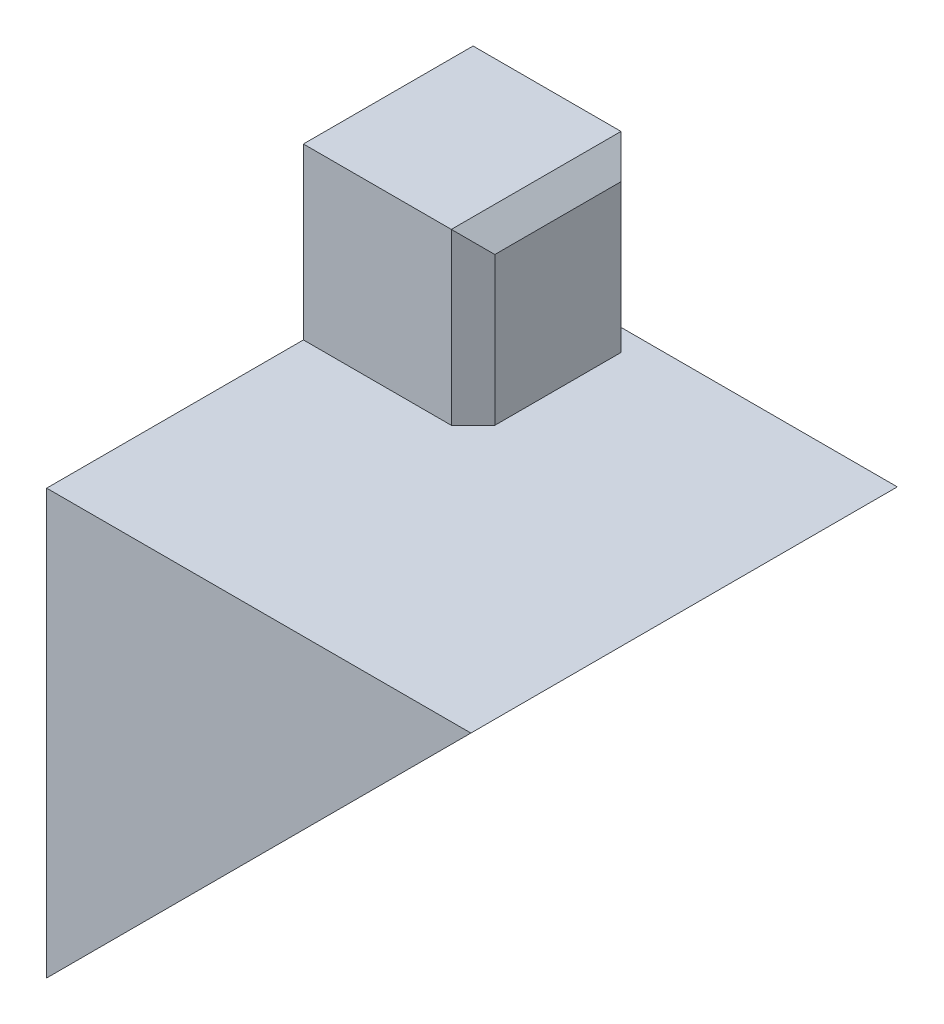
ISO-10303-21;
HEADER;
FILE_DESCRIPTION(('STEP AP214'),'2;1');
FILE_NAME('part.step','',(''),(''),'','','');
FILE_SCHEMA(('AUTOMOTIVE_DESIGN { 1 0 10303 214 1 1 1 1 }'));
ENDSEC;
DATA;
#1=APPLICATION_CONTEXT('core data for automotive mechanical design processes');
#2=APPLICATION_PROTOCOL_DEFINITION('international standard','automotive_design',2000,#1);
#3=PRODUCT_CONTEXT('',#1,'mechanical');
#4=PRODUCT('Part','Part','',(#3));
#5=PRODUCT_RELATED_PRODUCT_CATEGORY('part','',(#4));
#6=PRODUCT_DEFINITION_FORMATION('','',#4);
#7=PRODUCT_DEFINITION_CONTEXT('part definition',#1,'design');
#8=PRODUCT_DEFINITION('design','',#6,#7);
#9=PRODUCT_DEFINITION_SHAPE('','',#8);
#10=(LENGTH_UNIT() NAMED_UNIT(*) SI_UNIT(.MILLI.,.METRE.));
#11=(NAMED_UNIT(*) PLANE_ANGLE_UNIT() SI_UNIT($,.RADIAN.));
#12=(NAMED_UNIT(*) SI_UNIT($,.STERADIAN.) SOLID_ANGLE_UNIT());
#13=UNCERTAINTY_MEASURE_WITH_UNIT(LENGTH_MEASURE(1.E-05),#10,'distance_accuracy_value','');
#14=(GEOMETRIC_REPRESENTATION_CONTEXT(3) GLOBAL_UNCERTAINTY_ASSIGNED_CONTEXT((#13)) GLOBAL_UNIT_ASSIGNED_CONTEXT((#10,
#11,#12)) REPRESENTATION_CONTEXT('',''));
#15=CARTESIAN_POINT('',(0.,0.,0.));
#16=DIRECTION('',(0.,0.,1.));
#17=DIRECTION('',(1.,0.,0.));
#18=AXIS2_PLACEMENT_3D('',#15,#16,#17);
#19=CARTESIAN_POINT('',(0.,0.,-19.6));
#20=DIRECTION('',(0.,1.,0.));
#21=DIRECTION('',(0.,0.,1.));
#22=AXIS2_PLACEMENT_3D('',#19,#20,#21);
#23=PLANE('',#22);
#24=DIRECTION('',(1.,0.,0.));
#25=VECTOR('',#24,1.);
#26=CARTESIAN_POINT('',(0.,0.,-11.8));
#27=LINE('',#26,#25);
#28=CARTESIAN_POINT('',(0.,0.,-11.8));
#29=VERTEX_POINT('',#28);
#30=CARTESIAN_POINT('',(6.8,0.,-11.8));
#31=VERTEX_POINT('',#30);
#32=EDGE_CURVE('E140',#29,#31,#27,.T.);
#33=ORIENTED_EDGE('',*,*,#32,.F.);
#34=DIRECTION('',(0.,0.,1.));
#35=VECTOR('',#34,1.);
#36=CARTESIAN_POINT('',(0.,0.,-19.6));
#37=LINE('',#36,#35);
#38=CARTESIAN_POINT('',(0.,0.,0.));
#39=VERTEX_POINT('',#38);
#40=EDGE_CURVE('E153',#29,#39,#37,.T.);
#41=ORIENTED_EDGE('',*,*,#40,.T.);
#42=DIRECTION('',(-1.,0.,0.));
#43=VECTOR('',#42,1.);
#44=CARTESIAN_POINT('',(0.,0.,0.));
#45=LINE('',#44,#43);
#46=CARTESIAN_POINT('',(19.5,0.,0.));
#47=VERTEX_POINT('',#46);
#48=EDGE_CURVE('E136',#47,#39,#45,.T.);
#49=ORIENTED_EDGE('',*,*,#48,.F.);
#50=DIRECTION('',(0.,0.,1.));
#51=VECTOR('',#50,1.);
#52=CARTESIAN_POINT('',(19.5,0.,-19.6));
#53=LINE('',#52,#51);
#54=CARTESIAN_POINT('',(19.5,0.,-19.6));
#55=VERTEX_POINT('',#54);
#56=EDGE_CURVE('E164',#55,#47,#53,.T.);
#57=ORIENTED_EDGE('',*,*,#56,.F.);
#58=DIRECTION('',(-1.,0.,0.));
#59=VECTOR('',#58,1.);
#60=CARTESIAN_POINT('',(0.,0.,-19.6));
#61=LINE('',#60,#59);
#62=CARTESIAN_POINT('',(6.8,0.,-19.6));
#63=VERTEX_POINT('',#62);
#64=EDGE_CURVE('E59',#55,#63,#61,.T.);
#65=ORIENTED_EDGE('',*,*,#64,.T.);
#66=DIRECTION('',(0.707106781186545,0.,0.70710678118655));
#67=VECTOR('',#66,1.);
#68=CARTESIAN_POINT('',(6.8,0.,-19.6));
#69=LINE('',#68,#67);
#70=CARTESIAN_POINT('',(7.8,0.,-18.6));
#71=VERTEX_POINT('',#70);
#72=EDGE_CURVE('E11',#63,#71,#69,.T.);
#73=ORIENTED_EDGE('',*,*,#72,.T.);
#74=DIRECTION('',(0.,0.,-1.));
#75=VECTOR('',#74,1.);
#76=CARTESIAN_POINT('',(7.8,0.,0.));
#77=LINE('',#76,#75);
#78=CARTESIAN_POINT('',(7.8,0.,-12.8));
#79=VERTEX_POINT('',#78);
#80=EDGE_CURVE('E144',#79,#71,#77,.T.);
#81=ORIENTED_EDGE('',*,*,#80,.F.);
#82=DIRECTION('',(0.707106781186545,0.,-0.70710678118655));
#83=VECTOR('',#82,1.);
#84=CARTESIAN_POINT('',(7.8,0.,-12.8));
#85=LINE('',#84,#83);
#86=EDGE_CURVE('E52',#79,#31,#85,.F.);
#87=ORIENTED_EDGE('',*,*,#86,.T.);
#88=EDGE_LOOP('',(#33,#41,#49,#57,#65,#73,#81,#87));
#89=FACE_BOUND('',#88,.T.);
#90=ADVANCED_FACE('F41',(#89),#23,.T.);
#91=CARTESIAN_POINT('',(19.5,0.,-19.6));
#92=DIRECTION('',(0.707106781186548,-0.707106781186547,0.));
#93=DIRECTION('',(0.707106781186547,0.707106781186548,0.));
#94=AXIS2_PLACEMENT_3D('',#91,#92,#93);
#95=PLANE('',#94);
#96=DIRECTION('',(0.707106781186547,0.707106781186548,0.));
#97=VECTOR('',#96,1.);
#98=CARTESIAN_POINT('',(19.5,0.,0.));
#99=LINE('',#98,#97);
#100=CARTESIAN_POINT('',(0.,-19.5,0.));
#101=VERTEX_POINT('',#100);
#102=EDGE_CURVE('E149',#101,#47,#99,.T.);
#103=ORIENTED_EDGE('',*,*,#102,.F.);
#104=DIRECTION('',(0.,0.,1.));
#105=VECTOR('',#104,1.);
#106=CARTESIAN_POINT('',(0.,-19.5,-19.6));
#107=LINE('',#106,#105);
#108=CARTESIAN_POINT('',(0.,-19.5,-19.6));
#109=VERTEX_POINT('',#108);
#110=EDGE_CURVE('E168',#109,#101,#107,.T.);
#111=ORIENTED_EDGE('',*,*,#110,.F.);
#112=DIRECTION('',(0.707106781186547,0.707106781186548,0.));
#113=VECTOR('',#112,1.);
#114=CARTESIAN_POINT('',(19.5,0.,-19.6));
#115=LINE('',#114,#113);
#116=EDGE_CURVE('E123',#109,#55,#115,.T.);
#117=ORIENTED_EDGE('',*,*,#116,.T.);
#118=ORIENTED_EDGE('',*,*,#56,.T.);
#119=EDGE_LOOP('',(#103,#111,#117,#118));
#120=FACE_BOUND('',#119,.T.);
#121=ADVANCED_FACE('F209',(#120),#95,.T.);
#122=CARTESIAN_POINT('',(0.,0.,-19.6));
#123=DIRECTION('',(-1.,0.,0.));
#124=DIRECTION('',(0.,-1.,0.));
#125=AXIS2_PLACEMENT_3D('',#122,#123,#124);
#126=PLANE('',#125);
#127=DIRECTION('',(0.,-1.,0.));
#128=VECTOR('',#127,1.);
#129=CARTESIAN_POINT('',(0.,0.,0.));
#130=LINE('',#129,#128);
#131=EDGE_CURVE('E157',#39,#101,#130,.T.);
#132=ORIENTED_EDGE('',*,*,#131,.F.);
#133=ORIENTED_EDGE('',*,*,#40,.F.);
#134=DIRECTION('',(0.,-1.,0.));
#135=VECTOR('',#134,1.);
#136=CARTESIAN_POINT('',(0.,7.8,-11.8));
#137=LINE('',#136,#135);
#138=CARTESIAN_POINT('',(0.,7.8,-11.8));
#139=VERTEX_POINT('',#138);
#140=EDGE_CURVE('E131',#139,#29,#137,.T.);
#141=ORIENTED_EDGE('',*,*,#140,.F.);
#142=DIRECTION('',(0.,0.,1.));
#143=VECTOR('',#142,1.);
#144=CARTESIAN_POINT('',(0.,7.8,0.));
#145=LINE('',#144,#143);
#146=CARTESIAN_POINT('',(0.,7.8,-19.6));
#147=VERTEX_POINT('',#146);
#148=EDGE_CURVE('E111',#147,#139,#145,.T.);
#149=ORIENTED_EDGE('',*,*,#148,.F.);
#150=DIRECTION('',(0.,-1.,0.));
#151=VECTOR('',#150,1.);
#152=CARTESIAN_POINT('',(0.,0.,-19.6));
#153=LINE('',#152,#151);
#154=EDGE_CURVE('E120',#147,#109,#153,.T.);
#155=ORIENTED_EDGE('',*,*,#154,.T.);
#156=ORIENTED_EDGE('',*,*,#110,.T.);
#157=EDGE_LOOP('',(#132,#133,#141,#149,#155,#156));
#158=FACE_BOUND('',#157,.T.);
#159=ADVANCED_FACE('F128',(#158),#126,.T.);
#160=CARTESIAN_POINT('',(0.,0.,-19.6));
#161=DIRECTION('',(0.,0.,-1.));
#162=DIRECTION('',(-1.,0.,0.));
#163=AXIS2_PLACEMENT_3D('',#160,#161,#162);
#164=PLANE('',#163);
#165=DIRECTION('',(-1.,0.,0.));
#166=VECTOR('',#165,1.);
#167=CARTESIAN_POINT('',(0.,7.8,-19.6));
#168=LINE('',#167,#166);
#169=CARTESIAN_POINT('',(6.8,7.8,-19.6));
#170=VERTEX_POINT('',#169);
#171=EDGE_CURVE('E107',#170,#147,#168,.T.);
#172=ORIENTED_EDGE('',*,*,#171,.F.);
#173=DIRECTION('',(0.,-1.,0.));
#174=VECTOR('',#173,1.);
#175=CARTESIAN_POINT('',(6.8,0.,-19.6));
#176=LINE('',#175,#174);
#177=EDGE_CURVE('E187',#170,#63,#176,.T.);
#178=ORIENTED_EDGE('',*,*,#177,.T.);
#179=ORIENTED_EDGE('',*,*,#64,.F.);
#180=ORIENTED_EDGE('',*,*,#116,.F.);
#181=ORIENTED_EDGE('',*,*,#154,.F.);
#182=EDGE_LOOP('',(#172,#178,#179,#180,#181));
#183=FACE_BOUND('',#182,.T.);
#184=ADVANCED_FACE('F121',(#183),#164,.T.);
#185=CARTESIAN_POINT('',(0.,0.,0.));
#186=DIRECTION('',(0.,0.,-1.));
#187=DIRECTION('',(-1.,0.,0.));
#188=AXIS2_PLACEMENT_3D('',#185,#186,#187);
#189=PLANE('',#188);
#190=ORIENTED_EDGE('',*,*,#48,.T.);
#191=ORIENTED_EDGE('',*,*,#131,.T.);
#192=ORIENTED_EDGE('',*,*,#102,.T.);
#193=EDGE_LOOP('',(#190,#191,#192));
#194=FACE_BOUND('',#193,.T.);
#195=ADVANCED_FACE('F212',(#194),#189,.F.);
#196=CARTESIAN_POINT('',(0.,7.8,-11.8));
#197=DIRECTION('',(0.,0.,-1.));
#198=DIRECTION('',(-1.,0.,0.));
#199=AXIS2_PLACEMENT_3D('',#196,#197,#198);
#200=PLANE('',#199);
#201=ORIENTED_EDGE('',*,*,#32,.T.);
#202=DIRECTION('',(0.,1.,0.));
#203=VECTOR('',#202,1.);
#204=CARTESIAN_POINT('',(6.8,7.8,-11.8));
#205=LINE('',#204,#203);
#206=CARTESIAN_POINT('',(6.8,7.8,-11.8));
#207=VERTEX_POINT('',#206);
#208=EDGE_CURVE('E182',#31,#207,#205,.T.);
#209=ORIENTED_EDGE('',*,*,#208,.T.);
#210=DIRECTION('',(1.,0.,0.));
#211=VECTOR('',#210,1.);
#212=CARTESIAN_POINT('',(0.,7.8,-11.8));
#213=LINE('',#212,#211);
#214=EDGE_CURVE('E116',#139,#207,#213,.T.);
#215=ORIENTED_EDGE('',*,*,#214,.F.);
#216=ORIENTED_EDGE('',*,*,#140,.T.);
#217=EDGE_LOOP('',(#201,#209,#215,#216));
#218=FACE_BOUND('',#217,.T.);
#219=ADVANCED_FACE('F214',(#218),#200,.F.);
#220=CARTESIAN_POINT('',(7.8,7.8,0.));
#221=DIRECTION('',(-1.,0.,0.));
#222=DIRECTION('',(0.,0.,1.));
#223=AXIS2_PLACEMENT_3D('',#220,#221,#222);
#224=PLANE('',#223);
#225=DIRECTION('',(0.,0.,1.));
#226=VECTOR('',#225,1.);
#227=CARTESIAN_POINT('',(7.8,6.8,-11.8));
#228=LINE('',#227,#226);
#229=CARTESIAN_POINT('',(7.8,6.8,-18.6));
#230=VERTEX_POINT('',#229);
#231=CARTESIAN_POINT('',(7.8,6.8,-12.8));
#232=VERTEX_POINT('',#231);
#233=EDGE_CURVE('E175',#230,#232,#228,.T.);
#234=ORIENTED_EDGE('',*,*,#233,.T.);
#235=DIRECTION('',(0.,-1.,0.));
#236=VECTOR('',#235,1.);
#237=CARTESIAN_POINT('',(7.8,7.8,-12.8));
#238=LINE('',#237,#236);
#239=EDGE_CURVE('E178',#232,#79,#238,.T.);
#240=ORIENTED_EDGE('',*,*,#239,.T.);
#241=ORIENTED_EDGE('',*,*,#80,.T.);
#242=DIRECTION('',(0.,1.,0.));
#243=VECTOR('',#242,1.);
#244=CARTESIAN_POINT('',(7.8,7.8,-18.6));
#245=LINE('',#244,#243);
#246=EDGE_CURVE('E167',#71,#230,#245,.T.);
#247=ORIENTED_EDGE('',*,*,#246,.T.);
#248=EDGE_LOOP('',(#234,#240,#241,#247));
#249=FACE_BOUND('',#248,.T.);
#250=ADVANCED_FACE('F219',(#249),#224,.F.);
#251=CARTESIAN_POINT('',(0.,7.8,0.));
#252=DIRECTION('',(0.,1.,0.));
#253=DIRECTION('',(0.,0.,1.));
#254=AXIS2_PLACEMENT_3D('',#251,#252,#253);
#255=PLANE('',#254);
#256=ORIENTED_EDGE('',*,*,#214,.T.);
#257=DIRECTION('',(0.,0.,-1.));
#258=VECTOR('',#257,1.);
#259=CARTESIAN_POINT('',(6.8,7.8,-19.6));
#260=LINE('',#259,#258);
#261=EDGE_CURVE('E67',#207,#170,#260,.T.);
#262=ORIENTED_EDGE('',*,*,#261,.T.);
#263=ORIENTED_EDGE('',*,*,#171,.T.);
#264=ORIENTED_EDGE('',*,*,#148,.T.);
#265=EDGE_LOOP('',(#256,#262,#263,#264));
#266=FACE_BOUND('',#265,.T.);
#267=ADVANCED_FACE('F109',(#266),#255,.T.);
#268=CARTESIAN_POINT('',(6.8,0.,-19.6));
#269=DIRECTION('',(0.70710678118655,0.,-0.707106781186545));
#270=DIRECTION('',(0.,1.,0.));
#271=AXIS2_PLACEMENT_3D('',#268,#269,#270);
#272=PLANE('',#271);
#273=ORIENTED_EDGE('',*,*,#72,.F.);
#274=ORIENTED_EDGE('',*,*,#177,.F.);
#275=DIRECTION('',(0.577350269189623,-0.577350269189627,0.577350269189627));
#276=VECTOR('',#275,1.);
#277=CARTESIAN_POINT('',(9.4,5.19999999999999,-17.));
#278=LINE('',#277,#276);
#279=EDGE_CURVE('E46',#230,#170,#278,.F.);
#280=ORIENTED_EDGE('',*,*,#279,.F.);
#281=ORIENTED_EDGE('',*,*,#246,.F.);
#282=EDGE_LOOP('',(#273,#274,#280,#281));
#283=FACE_BOUND('',#282,.T.);
#284=ADVANCED_FACE('F44',(#283),#272,.T.);
#285=CARTESIAN_POINT('',(6.8,7.8,0.));
#286=DIRECTION('',(0.70710678118655,0.707106781186545,0.));
#287=DIRECTION('',(0.,0.,1.));
#288=AXIS2_PLACEMENT_3D('',#285,#286,#287);
#289=PLANE('',#288);
#290=ORIENTED_EDGE('',*,*,#279,.T.);
#291=ORIENTED_EDGE('',*,*,#261,.F.);
#292=DIRECTION('',(-0.577350269189623,0.577350269189627,0.577350269189627));
#293=VECTOR('',#292,1.);
#294=CARTESIAN_POINT('',(2.86666666666668,11.7333333333334,-7.86666666666665));
#295=LINE('',#294,#293);
#296=EDGE_CURVE('E191',#232,#207,#295,.T.);
#297=ORIENTED_EDGE('',*,*,#296,.F.);
#298=ORIENTED_EDGE('',*,*,#233,.F.);
#299=EDGE_LOOP('',(#290,#291,#297,#298));
#300=FACE_BOUND('',#299,.T.);
#301=ADVANCED_FACE('F203',(#300),#289,.T.);
#302=CARTESIAN_POINT('',(7.8,7.8,-12.8));
#303=DIRECTION('',(-0.70710678118655,0.,-0.707106781186545));
#304=DIRECTION('',(0.,-1.,0.));
#305=AXIS2_PLACEMENT_3D('',#302,#303,#304);
#306=PLANE('',#305);
#307=ORIENTED_EDGE('',*,*,#296,.T.);
#308=ORIENTED_EDGE('',*,*,#208,.F.);
#309=ORIENTED_EDGE('',*,*,#86,.F.);
#310=ORIENTED_EDGE('',*,*,#239,.F.);
#311=EDGE_LOOP('',(#307,#308,#309,#310));
#312=FACE_BOUND('',#311,.T.);
#313=ADVANCED_FACE('F216',(#312),#306,.F.);
#314=CLOSED_SHELL('',(#90,#121,#159,#184,#195,#219,#250,#267,#284,#301,#313));
#315=MANIFOLD_SOLID_BREP('B2',#314);
#316=ADVANCED_BREP_SHAPE_REPRESENTATION('',(#18,#315),#14);
#317=SHAPE_DEFINITION_REPRESENTATION(#9,#316);
ENDSEC;
END-ISO-10303-21;
